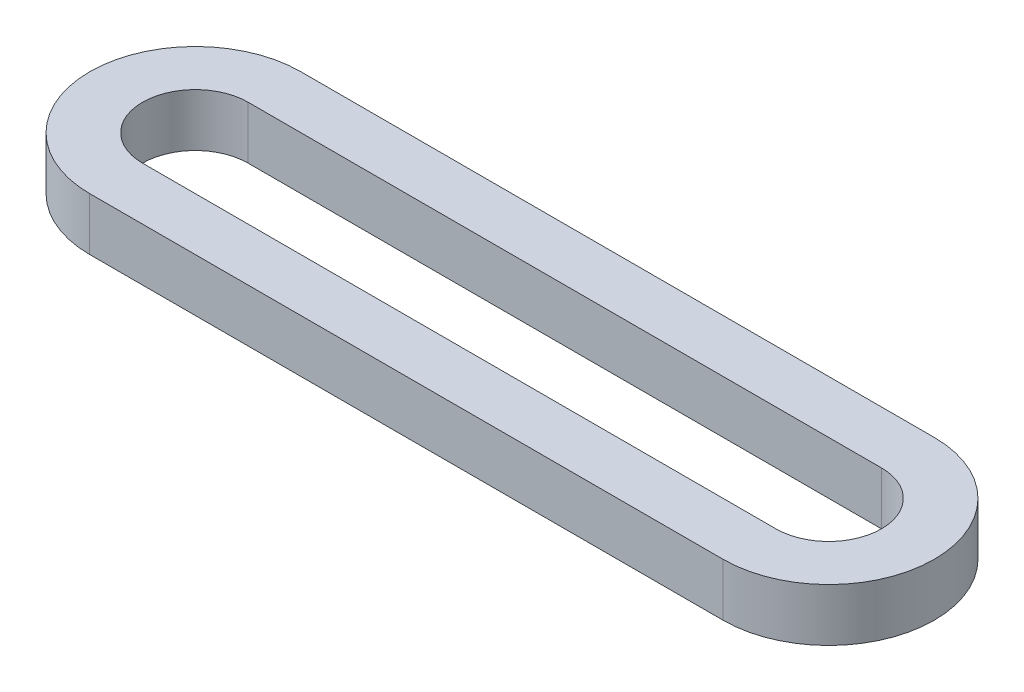
ISO-10303-21;
HEADER;
FILE_DESCRIPTION(('STEP AP214'),'2;1');
FILE_NAME('part.step','',(''),(''),'','','');
FILE_SCHEMA(('AUTOMOTIVE_DESIGN { 1 0 10303 214 1 1 1 1 }'));
ENDSEC;
DATA;
#1=APPLICATION_CONTEXT('core data for automotive mechanical design processes');
#2=APPLICATION_PROTOCOL_DEFINITION('international standard','automotive_design',2000,#1);
#3=PRODUCT_CONTEXT('',#1,'mechanical');
#4=PRODUCT('Part','Part','',(#3));
#5=PRODUCT_RELATED_PRODUCT_CATEGORY('part','',(#4));
#6=PRODUCT_DEFINITION_FORMATION('','',#4);
#7=PRODUCT_DEFINITION_CONTEXT('part definition',#1,'design');
#8=PRODUCT_DEFINITION('design','',#6,#7);
#9=PRODUCT_DEFINITION_SHAPE('','',#8);
#10=(LENGTH_UNIT() NAMED_UNIT(*) SI_UNIT(.MILLI.,.METRE.));
#11=(NAMED_UNIT(*) PLANE_ANGLE_UNIT() SI_UNIT($,.RADIAN.));
#12=(NAMED_UNIT(*) SI_UNIT($,.STERADIAN.) SOLID_ANGLE_UNIT());
#13=UNCERTAINTY_MEASURE_WITH_UNIT(LENGTH_MEASURE(1.E-05),#10,'distance_accuracy_value','');
#14=(GEOMETRIC_REPRESENTATION_CONTEXT(3) GLOBAL_UNCERTAINTY_ASSIGNED_CONTEXT((#13)) GLOBAL_UNIT_ASSIGNED_CONTEXT((#10,
#11,#12)) REPRESENTATION_CONTEXT('',''));
#15=CARTESIAN_POINT('',(0.,0.,0.));
#16=DIRECTION('',(0.,0.,1.));
#17=DIRECTION('',(1.,0.,0.));
#18=AXIS2_PLACEMENT_3D('',#15,#16,#17);
#19=CARTESIAN_POINT('',(0.,3.175,0.));
#20=DIRECTION('',(0.,1.,0.));
#21=DIRECTION('',(0.,0.,1.));
#22=AXIS2_PLACEMENT_3D('',#19,#20,#21);
#23=PLANE('',#22);
#24=CARTESIAN_POINT('',(0.,3.175,0.));
#25=DIRECTION('',(0.,1.,0.));
#26=DIRECTION('',(0.,0.,1.));
#27=AXIS2_PLACEMENT_3D('',#24,#25,#26);
#28=CIRCLE('',#27,6.35);
#29=CARTESIAN_POINT('',(0.,3.175,6.35));
#30=VERTEX_POINT('',#29);
#31=CARTESIAN_POINT('',(0.,3.175,-6.35));
#32=VERTEX_POINT('',#31);
#33=EDGE_CURVE('E157',#30,#32,#28,.T.);
#34=ORIENTED_EDGE('',*,*,#33,.T.);
#35=DIRECTION('',(-1.,0.,0.));
#36=VECTOR('',#35,1.);
#37=CARTESIAN_POINT('',(0.,3.175,-6.35));
#38=LINE('',#37,#36);
#39=CARTESIAN_POINT('',(-38.1,3.175,-6.35));
#40=VERTEX_POINT('',#39);
#41=EDGE_CURVE('E161',#32,#40,#38,.T.);
#42=ORIENTED_EDGE('',*,*,#41,.T.);
#43=CARTESIAN_POINT('',(-38.1,3.175,0.));
#44=DIRECTION('',(0.,1.,0.));
#45=DIRECTION('',(0.,0.,1.));
#46=AXIS2_PLACEMENT_3D('',#43,#44,#45);
#47=CIRCLE('',#46,6.35);
#48=CARTESIAN_POINT('',(-38.1,3.175,6.35));
#49=VERTEX_POINT('',#48);
#50=EDGE_CURVE('E165',#40,#49,#47,.T.);
#51=ORIENTED_EDGE('',*,*,#50,.T.);
#52=DIRECTION('',(1.,0.,0.));
#53=VECTOR('',#52,1.);
#54=CARTESIAN_POINT('',(0.,3.175,6.35));
#55=LINE('',#54,#53);
#56=EDGE_CURVE('E168',#49,#30,#55,.T.);
#57=ORIENTED_EDGE('',*,*,#56,.T.);
#58=EDGE_LOOP('',(#34,#42,#51,#57));
#59=FACE_BOUND('',#58,.T.);
#60=DIRECTION('',(-1.,0.,0.));
#61=VECTOR('',#60,1.);
#62=CARTESIAN_POINT('',(0.,3.175,-3.175));
#63=LINE('',#62,#61);
#64=CARTESIAN_POINT('',(0.,3.175,-3.175));
#65=VERTEX_POINT('',#64);
#66=CARTESIAN_POINT('',(-38.1,3.175,-3.175));
#67=VERTEX_POINT('',#66);
#68=EDGE_CURVE('E118',#65,#67,#63,.T.);
#69=ORIENTED_EDGE('',*,*,#68,.F.);
#70=CARTESIAN_POINT('',(0.,3.175,0.));
#71=DIRECTION('',(0.,1.,0.));
#72=DIRECTION('',(0.,0.,1.));
#73=AXIS2_PLACEMENT_3D('',#70,#71,#72);
#74=CIRCLE('',#73,3.175);
#75=CARTESIAN_POINT('',(0.,3.175,3.175));
#76=VERTEX_POINT('',#75);
#77=EDGE_CURVE('E109',#76,#65,#74,.T.);
#78=ORIENTED_EDGE('',*,*,#77,.F.);
#79=DIRECTION('',(1.,0.,0.));
#80=VECTOR('',#79,1.);
#81=CARTESIAN_POINT('',(0.,3.175,3.175));
#82=LINE('',#81,#80);
#83=CARTESIAN_POINT('',(-38.1,3.175,3.175));
#84=VERTEX_POINT('',#83);
#85=EDGE_CURVE('E135',#84,#76,#82,.T.);
#86=ORIENTED_EDGE('',*,*,#85,.F.);
#87=CARTESIAN_POINT('',(-38.1,3.175,0.));
#88=DIRECTION('',(0.,1.,0.));
#89=DIRECTION('',(0.,0.,1.));
#90=AXIS2_PLACEMENT_3D('',#87,#88,#89);
#91=CIRCLE('',#90,3.175);
#92=EDGE_CURVE('E131',#67,#84,#91,.T.);
#93=ORIENTED_EDGE('',*,*,#92,.F.);
#94=EDGE_LOOP('',(#69,#78,#86,#93));
#95=FACE_BOUND('',#94,.T.);
#96=ADVANCED_FACE('F43',(#59,#95),#23,.T.);
#97=CARTESIAN_POINT('',(0.,0.,0.));
#98=DIRECTION('',(0.,1.,0.));
#99=DIRECTION('',(0.,0.,1.));
#100=AXIS2_PLACEMENT_3D('',#97,#98,#99);
#101=PLANE('',#100);
#102=CARTESIAN_POINT('',(0.,0.,0.));
#103=DIRECTION('',(0.,1.,0.));
#104=DIRECTION('',(0.,0.,1.));
#105=AXIS2_PLACEMENT_3D('',#102,#103,#104);
#106=CIRCLE('',#105,6.35);
#107=CARTESIAN_POINT('',(0.,0.,6.35));
#108=VERTEX_POINT('',#107);
#109=CARTESIAN_POINT('',(0.,0.,-6.35));
#110=VERTEX_POINT('',#109);
#111=EDGE_CURVE('E127',#108,#110,#106,.T.);
#112=ORIENTED_EDGE('',*,*,#111,.F.);
#113=DIRECTION('',(1.,0.,0.));
#114=VECTOR('',#113,1.);
#115=CARTESIAN_POINT('',(0.,0.,6.35));
#116=LINE('',#115,#114);
#117=CARTESIAN_POINT('',(-38.1,0.,6.35));
#118=VERTEX_POINT('',#117);
#119=EDGE_CURVE('E162',#118,#108,#116,.T.);
#120=ORIENTED_EDGE('',*,*,#119,.F.);
#121=CARTESIAN_POINT('',(-38.1,0.,0.));
#122=DIRECTION('',(0.,1.,0.));
#123=DIRECTION('',(0.,0.,1.));
#124=AXIS2_PLACEMENT_3D('',#121,#122,#123);
#125=CIRCLE('',#124,6.35);
#126=CARTESIAN_POINT('',(-38.1,0.,-6.35));
#127=VERTEX_POINT('',#126);
#128=EDGE_CURVE('E178',#127,#118,#125,.T.);
#129=ORIENTED_EDGE('',*,*,#128,.F.);
#130=DIRECTION('',(-1.,0.,0.));
#131=VECTOR('',#130,1.);
#132=CARTESIAN_POINT('',(0.,0.,-6.35));
#133=LINE('',#132,#131);
#134=EDGE_CURVE('E175',#110,#127,#133,.T.);
#135=ORIENTED_EDGE('',*,*,#134,.F.);
#136=EDGE_LOOP('',(#112,#120,#129,#135));
#137=FACE_BOUND('',#136,.T.);
#138=CARTESIAN_POINT('',(0.,0.,0.));
#139=DIRECTION('',(0.,1.,0.));
#140=DIRECTION('',(0.,0.,1.));
#141=AXIS2_PLACEMENT_3D('',#138,#139,#140);
#142=CIRCLE('',#141,3.175);
#143=CARTESIAN_POINT('',(0.,0.,3.175));
#144=VERTEX_POINT('',#143);
#145=CARTESIAN_POINT('',(0.,0.,-3.175));
#146=VERTEX_POINT('',#145);
#147=EDGE_CURVE('E67',#144,#146,#142,.T.);
#148=ORIENTED_EDGE('',*,*,#147,.T.);
#149=DIRECTION('',(-1.,0.,0.));
#150=VECTOR('',#149,1.);
#151=CARTESIAN_POINT('',(0.,0.,-3.175));
#152=LINE('',#151,#150);
#153=CARTESIAN_POINT('',(-38.1,0.,-3.175));
#154=VERTEX_POINT('',#153);
#155=EDGE_CURVE('E125',#146,#154,#152,.T.);
#156=ORIENTED_EDGE('',*,*,#155,.T.);
#157=CARTESIAN_POINT('',(-38.1,0.,0.));
#158=DIRECTION('',(0.,1.,0.));
#159=DIRECTION('',(0.,0.,1.));
#160=AXIS2_PLACEMENT_3D('',#157,#158,#159);
#161=CIRCLE('',#160,3.175);
#162=CARTESIAN_POINT('',(-38.1,0.,3.175));
#163=VERTEX_POINT('',#162);
#164=EDGE_CURVE('E144',#154,#163,#161,.T.);
#165=ORIENTED_EDGE('',*,*,#164,.T.);
#166=DIRECTION('',(1.,0.,0.));
#167=VECTOR('',#166,1.);
#168=CARTESIAN_POINT('',(0.,0.,3.175));
#169=LINE('',#168,#167);
#170=EDGE_CURVE('E119',#163,#144,#169,.T.);
#171=ORIENTED_EDGE('',*,*,#170,.T.);
#172=EDGE_LOOP('',(#148,#156,#165,#171));
#173=FACE_BOUND('',#172,.T.);
#174=ADVANCED_FACE('F201',(#137,#173),#101,.F.);
#175=CARTESIAN_POINT('',(0.,3.175,0.));
#176=DIRECTION('',(0.,-1.,0.));
#177=DIRECTION('',(0.,0.,-1.));
#178=AXIS2_PLACEMENT_3D('',#175,#176,#177);
#179=CYLINDRICAL_SURFACE('',#178,6.35);
#180=ORIENTED_EDGE('',*,*,#111,.T.);
#181=DIRECTION('',(0.,-1.,0.));
#182=VECTOR('',#181,1.);
#183=CARTESIAN_POINT('',(0.,3.175,-6.35));
#184=LINE('',#183,#182);
#185=EDGE_CURVE('E11',#32,#110,#184,.T.);
#186=ORIENTED_EDGE('',*,*,#185,.F.);
#187=ORIENTED_EDGE('',*,*,#33,.F.);
#188=DIRECTION('',(0.,-1.,0.));
#189=VECTOR('',#188,1.);
#190=CARTESIAN_POINT('',(0.,3.175,6.35));
#191=LINE('',#190,#189);
#192=EDGE_CURVE('E171',#30,#108,#191,.T.);
#193=ORIENTED_EDGE('',*,*,#192,.T.);
#194=EDGE_LOOP('',(#180,#186,#187,#193));
#195=FACE_BOUND('',#194,.T.);
#196=ADVANCED_FACE('F45',(#195),#179,.T.);
#197=CARTESIAN_POINT('',(0.,3.175,-6.35));
#198=DIRECTION('',(0.,0.,1.));
#199=DIRECTION('',(1.,0.,0.));
#200=AXIS2_PLACEMENT_3D('',#197,#198,#199);
#201=PLANE('',#200);
#202=ORIENTED_EDGE('',*,*,#134,.T.);
#203=DIRECTION('',(0.,-1.,0.));
#204=VECTOR('',#203,1.);
#205=CARTESIAN_POINT('',(-38.1,3.175,-6.35));
#206=LINE('',#205,#204);
#207=EDGE_CURVE('E52',#40,#127,#206,.T.);
#208=ORIENTED_EDGE('',*,*,#207,.F.);
#209=ORIENTED_EDGE('',*,*,#41,.F.);
#210=ORIENTED_EDGE('',*,*,#185,.T.);
#211=EDGE_LOOP('',(#202,#208,#209,#210));
#212=FACE_BOUND('',#211,.T.);
#213=ADVANCED_FACE('F211',(#212),#201,.F.);
#214=CARTESIAN_POINT('',(-38.1,3.175,0.));
#215=DIRECTION('',(0.,-1.,0.));
#216=DIRECTION('',(0.,0.,-1.));
#217=AXIS2_PLACEMENT_3D('',#214,#215,#216);
#218=CYLINDRICAL_SURFACE('',#217,6.35);
#219=ORIENTED_EDGE('',*,*,#128,.T.);
#220=DIRECTION('',(0.,-1.,0.));
#221=VECTOR('',#220,1.);
#222=CARTESIAN_POINT('',(-38.1,3.175,6.35));
#223=LINE('',#222,#221);
#224=EDGE_CURVE('E186',#49,#118,#223,.T.);
#225=ORIENTED_EDGE('',*,*,#224,.F.);
#226=ORIENTED_EDGE('',*,*,#50,.F.);
#227=ORIENTED_EDGE('',*,*,#207,.T.);
#228=EDGE_LOOP('',(#219,#225,#226,#227));
#229=FACE_BOUND('',#228,.T.);
#230=ADVANCED_FACE('F195',(#229),#218,.T.);
#231=CARTESIAN_POINT('',(0.,3.175,6.35));
#232=DIRECTION('',(0.,0.,-1.));
#233=DIRECTION('',(-1.,0.,0.));
#234=AXIS2_PLACEMENT_3D('',#231,#232,#233);
#235=PLANE('',#234);
#236=ORIENTED_EDGE('',*,*,#119,.T.);
#237=ORIENTED_EDGE('',*,*,#192,.F.);
#238=ORIENTED_EDGE('',*,*,#56,.F.);
#239=ORIENTED_EDGE('',*,*,#224,.T.);
#240=EDGE_LOOP('',(#236,#237,#238,#239));
#241=FACE_BOUND('',#240,.T.);
#242=ADVANCED_FACE('F205',(#241),#235,.F.);
#243=CARTESIAN_POINT('',(0.,3.175,0.));
#244=DIRECTION('',(0.,-1.,0.));
#245=DIRECTION('',(0.,0.,-1.));
#246=AXIS2_PLACEMENT_3D('',#243,#244,#245);
#247=CYLINDRICAL_SURFACE('',#246,3.175);
#248=ORIENTED_EDGE('',*,*,#147,.F.);
#249=DIRECTION('',(0.,-1.,0.));
#250=VECTOR('',#249,1.);
#251=CARTESIAN_POINT('',(0.,3.175,3.175));
#252=LINE('',#251,#250);
#253=EDGE_CURVE('E113',#76,#144,#252,.T.);
#254=ORIENTED_EDGE('',*,*,#253,.F.);
#255=ORIENTED_EDGE('',*,*,#77,.T.);
#256=DIRECTION('',(0.,-1.,0.));
#257=VECTOR('',#256,1.);
#258=CARTESIAN_POINT('',(0.,3.175,-3.175));
#259=LINE('',#258,#257);
#260=EDGE_CURVE('E112',#65,#146,#259,.T.);
#261=ORIENTED_EDGE('',*,*,#260,.T.);
#262=EDGE_LOOP('',(#248,#254,#255,#261));
#263=FACE_BOUND('',#262,.T.);
#264=ADVANCED_FACE('F111',(#263),#247,.F.);
#265=CARTESIAN_POINT('',(0.,3.175,-3.175));
#266=DIRECTION('',(0.,0.,1.));
#267=DIRECTION('',(1.,0.,0.));
#268=AXIS2_PLACEMENT_3D('',#265,#266,#267);
#269=PLANE('',#268);
#270=ORIENTED_EDGE('',*,*,#155,.F.);
#271=ORIENTED_EDGE('',*,*,#260,.F.);
#272=ORIENTED_EDGE('',*,*,#68,.T.);
#273=DIRECTION('',(0.,-1.,0.));
#274=VECTOR('',#273,1.);
#275=CARTESIAN_POINT('',(-38.1,3.175,-3.175));
#276=LINE('',#275,#274);
#277=EDGE_CURVE('E128',#67,#154,#276,.T.);
#278=ORIENTED_EDGE('',*,*,#277,.T.);
#279=EDGE_LOOP('',(#270,#271,#272,#278));
#280=FACE_BOUND('',#279,.T.);
#281=ADVANCED_FACE('F122',(#280),#269,.T.);
#282=CARTESIAN_POINT('',(-38.1,3.175,0.));
#283=DIRECTION('',(0.,-1.,0.));
#284=DIRECTION('',(0.,0.,-1.));
#285=AXIS2_PLACEMENT_3D('',#282,#283,#284);
#286=CYLINDRICAL_SURFACE('',#285,3.175);
#287=ORIENTED_EDGE('',*,*,#164,.F.);
#288=ORIENTED_EDGE('',*,*,#277,.F.);
#289=ORIENTED_EDGE('',*,*,#92,.T.);
#290=DIRECTION('',(0.,-1.,0.));
#291=VECTOR('',#290,1.);
#292=CARTESIAN_POINT('',(-38.1,3.175,3.175));
#293=LINE('',#292,#291);
#294=EDGE_CURVE('E59',#84,#163,#293,.T.);
#295=ORIENTED_EDGE('',*,*,#294,.T.);
#296=EDGE_LOOP('',(#287,#288,#289,#295));
#297=FACE_BOUND('',#296,.T.);
#298=ADVANCED_FACE('F234',(#297),#286,.F.);
#299=CARTESIAN_POINT('',(0.,3.175,3.175));
#300=DIRECTION('',(0.,0.,-1.));
#301=DIRECTION('',(-1.,0.,0.));
#302=AXIS2_PLACEMENT_3D('',#299,#300,#301);
#303=PLANE('',#302);
#304=ORIENTED_EDGE('',*,*,#170,.F.);
#305=ORIENTED_EDGE('',*,*,#294,.F.);
#306=ORIENTED_EDGE('',*,*,#85,.T.);
#307=ORIENTED_EDGE('',*,*,#253,.T.);
#308=EDGE_LOOP('',(#304,#305,#306,#307));
#309=FACE_BOUND('',#308,.T.);
#310=ADVANCED_FACE('F238',(#309),#303,.T.);
#311=CLOSED_SHELL('',(#96,#174,#196,#213,#230,#242,#264,#281,#298,#310));
#312=MANIFOLD_SOLID_BREP('B2',#311);
#313=ADVANCED_BREP_SHAPE_REPRESENTATION('',(#18,#312),#14);
#314=SHAPE_DEFINITION_REPRESENTATION(#9,#313);
ENDSEC;
END-ISO-10303-21;
